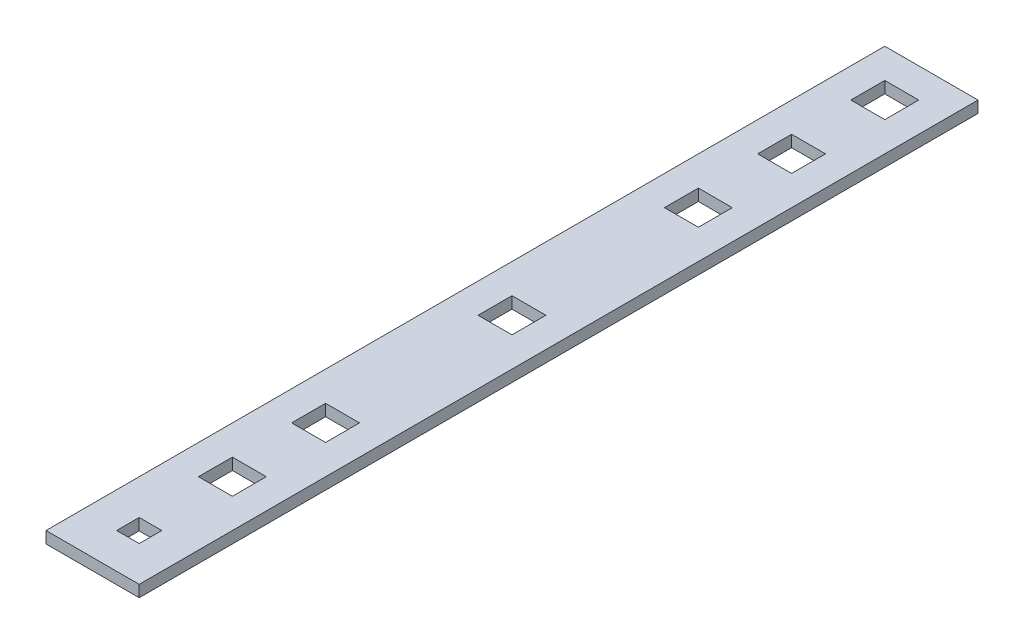
ISO-10303-21;
HEADER;
FILE_DESCRIPTION(('STEP AP214'),'2;1');
FILE_NAME('part.step','',(''),(''),'','','');
FILE_SCHEMA(('AUTOMOTIVE_DESIGN { 1 0 10303 214 1 1 1 1 }'));
ENDSEC;
DATA;
#1=APPLICATION_CONTEXT('core data for automotive mechanical design processes');
#2=APPLICATION_PROTOCOL_DEFINITION('international standard','automotive_design',2000,#1);
#3=PRODUCT_CONTEXT('',#1,'mechanical');
#4=PRODUCT('Part','Part','',(#3));
#5=PRODUCT_RELATED_PRODUCT_CATEGORY('part','',(#4));
#6=PRODUCT_DEFINITION_FORMATION('','',#4);
#7=PRODUCT_DEFINITION_CONTEXT('part definition',#1,'design');
#8=PRODUCT_DEFINITION('design','',#6,#7);
#9=PRODUCT_DEFINITION_SHAPE('','',#8);
#10=(LENGTH_UNIT() NAMED_UNIT(*) SI_UNIT(.MILLI.,.METRE.));
#11=(NAMED_UNIT(*) PLANE_ANGLE_UNIT() SI_UNIT($,.RADIAN.));
#12=(NAMED_UNIT(*) SI_UNIT($,.STERADIAN.) SOLID_ANGLE_UNIT());
#13=UNCERTAINTY_MEASURE_WITH_UNIT(LENGTH_MEASURE(1.E-05),#10,'distance_accuracy_value','');
#14=(GEOMETRIC_REPRESENTATION_CONTEXT(3) GLOBAL_UNCERTAINTY_ASSIGNED_CONTEXT((#13)) GLOBAL_UNIT_ASSIGNED_CONTEXT((#10,
#11,#12)) REPRESENTATION_CONTEXT('',''));
#15=CARTESIAN_POINT('',(0.,0.,0.));
#16=DIRECTION('',(0.,0.,1.));
#17=DIRECTION('',(1.,0.,0.));
#18=AXIS2_PLACEMENT_3D('',#15,#16,#17);
#19=CARTESIAN_POINT('',(0.,1.5875,0.));
#20=DIRECTION('',(0.,1.,0.));
#21=DIRECTION('',(0.,0.,1.));
#22=AXIS2_PLACEMENT_3D('',#19,#20,#21);
#23=PLANE('',#22);
#24=DIRECTION('',(0.,0.,1.));
#25=VECTOR('',#24,1.);
#26=CARTESIAN_POINT('',(0.,1.5875,-101.537542425712));
#27=LINE('',#26,#25);
#28=CARTESIAN_POINT('',(0.,1.5875,-101.537542425712));
#29=VERTEX_POINT('',#28);
#30=CARTESIAN_POINT('',(0.,1.5875,12.7624575742885));
#31=VERTEX_POINT('',#30);
#32=EDGE_CURVE('E464',#29,#31,#27,.T.);
#33=ORIENTED_EDGE('',*,*,#32,.T.);
#34=DIRECTION('',(1.,0.,0.));
#35=VECTOR('',#34,1.);
#36=CARTESIAN_POINT('',(0.,1.5875,12.7624575742885));
#37=LINE('',#36,#35);
#38=CARTESIAN_POINT('',(12.7,1.5875,12.7624575742885));
#39=VERTEX_POINT('',#38);
#40=EDGE_CURVE('E467',#31,#39,#37,.T.);
#41=ORIENTED_EDGE('',*,*,#40,.T.);
#42=DIRECTION('',(0.,0.,-1.));
#43=VECTOR('',#42,1.);
#44=CARTESIAN_POINT('',(12.7,1.5875,-101.537542425712));
#45=LINE('',#44,#43);
#46=CARTESIAN_POINT('',(12.7,1.5875,-101.537542425712));
#47=VERTEX_POINT('',#46);
#48=EDGE_CURVE('E470',#39,#47,#45,.T.);
#49=ORIENTED_EDGE('',*,*,#48,.T.);
#50=DIRECTION('',(-1.,0.,0.));
#51=VECTOR('',#50,1.);
#52=CARTESIAN_POINT('',(0.,1.5875,-101.537542425712));
#53=LINE('',#52,#51);
#54=EDGE_CURVE('E472',#47,#29,#53,.T.);
#55=ORIENTED_EDGE('',*,*,#54,.T.);
#56=EDGE_LOOP('',(#33,#41,#49,#55));
#57=FACE_BOUND('',#56,.T.);
#58=DIRECTION('',(1.,0.,0.));
#59=VECTOR('',#58,1.);
#60=CARTESIAN_POINT('',(4.0372,1.5875,-92.8747424257115));
#61=LINE('',#60,#59);
#62=CARTESIAN_POINT('',(4.0372,1.5875,-92.8747424257115));
#63=VERTEX_POINT('',#62);
#64=CARTESIAN_POINT('',(8.66,1.5875,-92.8747424257115));
#65=VERTEX_POINT('',#64);
#66=EDGE_CURVE('E435',#63,#65,#61,.T.);
#67=ORIENTED_EDGE('',*,*,#66,.F.);
#68=DIRECTION('',(0.,0.,1.));
#69=VECTOR('',#68,1.);
#70=CARTESIAN_POINT('',(4.0372,1.5875,-97.4975424257115));
#71=LINE('',#70,#69);
#72=CARTESIAN_POINT('',(4.0372,1.5875,-97.4975424257115));
#73=VERTEX_POINT('',#72);
#74=EDGE_CURVE('E433',#73,#63,#71,.T.);
#75=ORIENTED_EDGE('',*,*,#74,.F.);
#76=DIRECTION('',(-1.,0.,0.));
#77=VECTOR('',#76,1.);
#78=CARTESIAN_POINT('',(4.0372,1.5875,-97.4975424257115));
#79=LINE('',#78,#77);
#80=CARTESIAN_POINT('',(8.66,1.5875,-97.4975424257115));
#81=VERTEX_POINT('',#80);
#82=EDGE_CURVE('E441',#81,#73,#79,.T.);
#83=ORIENTED_EDGE('',*,*,#82,.F.);
#84=DIRECTION('',(0.,0.,-1.));
#85=VECTOR('',#84,1.);
#86=CARTESIAN_POINT('',(8.66,1.5875,-97.4975424257115));
#87=LINE('',#86,#85);
#88=EDGE_CURVE('E438',#65,#81,#87,.T.);
#89=ORIENTED_EDGE('',*,*,#88,.F.);
#90=EDGE_LOOP('',(#67,#75,#83,#89));
#91=FACE_BOUND('',#90,.T.);
#92=DIRECTION('',(0.,0.,1.));
#93=VECTOR('',#92,1.);
#94=CARTESIAN_POINT('',(4.03720000000013,1.5875,-84.7975424257115));
#95=LINE('',#94,#93);
#96=CARTESIAN_POINT('',(4.03720000000013,1.5875,-84.7975424257115));
#97=VERTEX_POINT('',#96);
#98=CARTESIAN_POINT('',(4.03720000000013,1.5875,-80.1747424257115));
#99=VERTEX_POINT('',#98);
#100=EDGE_CURVE('E404',#97,#99,#95,.T.);
#101=ORIENTED_EDGE('',*,*,#100,.F.);
#102=DIRECTION('',(-1.,0.,0.));
#103=VECTOR('',#102,1.);
#104=CARTESIAN_POINT('',(4.03720000000013,1.5875,-84.7975424257115));
#105=LINE('',#104,#103);
#106=CARTESIAN_POINT('',(8.66000000000013,1.5875,-84.7975424257115));
#107=VERTEX_POINT('',#106);
#108=EDGE_CURVE('E402',#107,#97,#105,.T.);
#109=ORIENTED_EDGE('',*,*,#108,.F.);
#110=DIRECTION('',(0.,0.,-1.));
#111=VECTOR('',#110,1.);
#112=CARTESIAN_POINT('',(8.66000000000013,1.5875,-84.7975424257115));
#113=LINE('',#112,#111);
#114=CARTESIAN_POINT('',(8.66000000000013,1.5875,-80.1747424257115));
#115=VERTEX_POINT('',#114);
#116=EDGE_CURVE('E410',#115,#107,#113,.T.);
#117=ORIENTED_EDGE('',*,*,#116,.F.);
#118=DIRECTION('',(1.,0.,0.));
#119=VECTOR('',#118,1.);
#120=CARTESIAN_POINT('',(4.03720000000013,1.5875,-80.1747424257115));
#121=LINE('',#120,#119);
#122=EDGE_CURVE('E407',#99,#115,#121,.T.);
#123=ORIENTED_EDGE('',*,*,#122,.F.);
#124=EDGE_LOOP('',(#101,#109,#117,#123));
#125=FACE_BOUND('',#124,.T.);
#126=DIRECTION('',(1.,0.,0.));
#127=VECTOR('',#126,1.);
#128=CARTESIAN_POINT('',(4.81000000000001,1.5875,7.95245757428848));
#129=LINE('',#128,#127);
#130=CARTESIAN_POINT('',(4.81000000000001,1.5875,7.95245757428848));
#131=VERTEX_POINT('',#130);
#132=CARTESIAN_POINT('',(7.89000000000001,1.5875,7.95245757428848));
#133=VERTEX_POINT('',#132);
#134=EDGE_CURVE('E373',#131,#133,#129,.T.);
#135=ORIENTED_EDGE('',*,*,#134,.F.);
#136=DIRECTION('',(0.,0.,1.));
#137=VECTOR('',#136,1.);
#138=CARTESIAN_POINT('',(4.81000000000001,1.5875,4.87245757428848));
#139=LINE('',#138,#137);
#140=CARTESIAN_POINT('',(4.81000000000001,1.5875,4.87245757428848));
#141=VERTEX_POINT('',#140);
#142=EDGE_CURVE('E371',#141,#131,#139,.T.);
#143=ORIENTED_EDGE('',*,*,#142,.F.);
#144=DIRECTION('',(-1.,0.,0.));
#145=VECTOR('',#144,1.);
#146=CARTESIAN_POINT('',(4.81000000000001,1.5875,4.87245757428848));
#147=LINE('',#146,#145);
#148=CARTESIAN_POINT('',(7.89000000000001,1.5875,4.87245757428848));
#149=VERTEX_POINT('',#148);
#150=EDGE_CURVE('E379',#149,#141,#147,.T.);
#151=ORIENTED_EDGE('',*,*,#150,.F.);
#152=DIRECTION('',(0.,0.,-1.));
#153=VECTOR('',#152,1.);
#154=CARTESIAN_POINT('',(7.89000000000001,1.5875,4.87245757428848));
#155=LINE('',#154,#153);
#156=EDGE_CURVE('E376',#133,#149,#155,.T.);
#157=ORIENTED_EDGE('',*,*,#156,.F.);
#158=EDGE_LOOP('',(#135,#143,#151,#157));
#159=FACE_BOUND('',#158,.T.);
#160=DIRECTION('',(0.,0.,1.));
#161=VECTOR('',#160,1.);
#162=CARTESIAN_POINT('',(4.03720000000027,1.5875,-72.0975424257115));
#163=LINE('',#162,#161);
#164=CARTESIAN_POINT('',(4.03720000000027,1.5875,-72.0975424257115));
#165=VERTEX_POINT('',#164);
#166=CARTESIAN_POINT('',(4.03720000000027,1.5875,-67.4747424257115));
#167=VERTEX_POINT('',#166);
#168=EDGE_CURVE('E342',#165,#167,#163,.T.);
#169=ORIENTED_EDGE('',*,*,#168,.F.);
#170=DIRECTION('',(-1.,0.,0.));
#171=VECTOR('',#170,1.);
#172=CARTESIAN_POINT('',(4.03720000000027,1.5875,-72.0975424257115));
#173=LINE('',#172,#171);
#174=CARTESIAN_POINT('',(8.66000000000026,1.5875,-72.0975424257115));
#175=VERTEX_POINT('',#174);
#176=EDGE_CURVE('E340',#175,#165,#173,.T.);
#177=ORIENTED_EDGE('',*,*,#176,.F.);
#178=DIRECTION('',(0.,0.,-1.));
#179=VECTOR('',#178,1.);
#180=CARTESIAN_POINT('',(8.66000000000026,1.5875,-72.0975424257115));
#181=LINE('',#180,#179);
#182=CARTESIAN_POINT('',(8.66000000000026,1.5875,-67.4747424257115));
#183=VERTEX_POINT('',#182);
#184=EDGE_CURVE('E348',#183,#175,#181,.T.);
#185=ORIENTED_EDGE('',*,*,#184,.F.);
#186=DIRECTION('',(1.,0.,0.));
#187=VECTOR('',#186,1.);
#188=CARTESIAN_POINT('',(4.03720000000027,1.5875,-67.4747424257115));
#189=LINE('',#188,#187);
#190=EDGE_CURVE('E345',#167,#183,#189,.T.);
#191=ORIENTED_EDGE('',*,*,#190,.F.);
#192=EDGE_LOOP('',(#169,#177,#185,#191));
#193=FACE_BOUND('',#192,.T.);
#194=DIRECTION('',(0.,0.,1.));
#195=VECTOR('',#194,1.);
#196=CARTESIAN_POINT('',(4.03720000000053,1.5875,-46.6975424257115));
#197=LINE('',#196,#195);
#198=CARTESIAN_POINT('',(4.03720000000053,1.5875,-46.6975424257115));
#199=VERTEX_POINT('',#198);
#200=CARTESIAN_POINT('',(4.03720000000053,1.5875,-42.0747424257115));
#201=VERTEX_POINT('',#200);
#202=EDGE_CURVE('E311',#199,#201,#197,.T.);
#203=ORIENTED_EDGE('',*,*,#202,.F.);
#204=DIRECTION('',(-1.,0.,0.));
#205=VECTOR('',#204,1.);
#206=CARTESIAN_POINT('',(4.03720000000053,1.5875,-46.6975424257115));
#207=LINE('',#206,#205);
#208=CARTESIAN_POINT('',(8.66000000000053,1.5875,-46.6975424257115));
#209=VERTEX_POINT('',#208);
#210=EDGE_CURVE('E309',#209,#199,#207,.T.);
#211=ORIENTED_EDGE('',*,*,#210,.F.);
#212=DIRECTION('',(0.,0.,-1.));
#213=VECTOR('',#212,1.);
#214=CARTESIAN_POINT('',(8.66000000000053,1.5875,-46.6975424257115));
#215=LINE('',#214,#213);
#216=CARTESIAN_POINT('',(8.66000000000053,1.5875,-42.0747424257115));
#217=VERTEX_POINT('',#216);
#218=EDGE_CURVE('E317',#217,#209,#215,.T.);
#219=ORIENTED_EDGE('',*,*,#218,.F.);
#220=DIRECTION('',(1.,0.,0.));
#221=VECTOR('',#220,1.);
#222=CARTESIAN_POINT('',(4.03720000000053,1.5875,-42.0747424257115));
#223=LINE('',#222,#221);
#224=EDGE_CURVE('E314',#201,#217,#223,.T.);
#225=ORIENTED_EDGE('',*,*,#224,.F.);
#226=EDGE_LOOP('',(#203,#211,#219,#225));
#227=FACE_BOUND('',#226,.T.);
#228=DIRECTION('',(0.,0.,1.));
#229=VECTOR('',#228,1.);
#230=CARTESIAN_POINT('',(4.0372000000008,1.5875,-21.2975424257115));
#231=LINE('',#230,#229);
#232=CARTESIAN_POINT('',(4.0372000000008,1.5875,-21.2975424257115));
#233=VERTEX_POINT('',#232);
#234=CARTESIAN_POINT('',(4.0372000000008,1.5875,-16.6747424257115));
#235=VERTEX_POINT('',#234);
#236=EDGE_CURVE('E280',#233,#235,#231,.T.);
#237=ORIENTED_EDGE('',*,*,#236,.F.);
#238=DIRECTION('',(-1.,0.,0.));
#239=VECTOR('',#238,1.);
#240=CARTESIAN_POINT('',(4.0372000000008,1.5875,-21.2975424257115));
#241=LINE('',#240,#239);
#242=CARTESIAN_POINT('',(8.6600000000008,1.5875,-21.2975424257115));
#243=VERTEX_POINT('',#242);
#244=EDGE_CURVE('E278',#243,#233,#241,.T.);
#245=ORIENTED_EDGE('',*,*,#244,.F.);
#246=DIRECTION('',(0.,0.,-1.));
#247=VECTOR('',#246,1.);
#248=CARTESIAN_POINT('',(8.6600000000008,1.5875,-21.2975424257115));
#249=LINE('',#248,#247);
#250=CARTESIAN_POINT('',(8.6600000000008,1.5875,-16.6747424257115));
#251=VERTEX_POINT('',#250);
#252=EDGE_CURVE('E286',#251,#243,#249,.T.);
#253=ORIENTED_EDGE('',*,*,#252,.F.);
#254=DIRECTION('',(1.,0.,0.));
#255=VECTOR('',#254,1.);
#256=CARTESIAN_POINT('',(4.0372000000008,1.5875,-16.6747424257115));
#257=LINE('',#256,#255);
#258=EDGE_CURVE('E283',#235,#251,#257,.T.);
#259=ORIENTED_EDGE('',*,*,#258,.F.);
#260=EDGE_LOOP('',(#237,#245,#253,#259));
#261=FACE_BOUND('',#260,.T.);
#262=DIRECTION('',(0.,0.,1.));
#263=VECTOR('',#262,1.);
#264=CARTESIAN_POINT('',(4.03720000000093,1.5875,-8.59754242571152));
#265=LINE('',#264,#263);
#266=CARTESIAN_POINT('',(4.03720000000093,1.5875,-8.59754242571152));
#267=VERTEX_POINT('',#266);
#268=CARTESIAN_POINT('',(4.03720000000093,1.5875,-3.97474242571152));
#269=VERTEX_POINT('',#268);
#270=EDGE_CURVE('E250',#267,#269,#265,.T.);
#271=ORIENTED_EDGE('',*,*,#270,.F.);
#272=DIRECTION('',(-1.,0.,0.));
#273=VECTOR('',#272,1.);
#274=CARTESIAN_POINT('',(4.03720000000093,1.5875,-8.59754242571152));
#275=LINE('',#274,#273);
#276=CARTESIAN_POINT('',(8.66000000000093,1.5875,-8.59754242571152));
#277=VERTEX_POINT('',#276);
#278=EDGE_CURVE('E242',#277,#267,#275,.T.);
#279=ORIENTED_EDGE('',*,*,#278,.F.);
#280=DIRECTION('',(0.,0.,-1.));
#281=VECTOR('',#280,1.);
#282=CARTESIAN_POINT('',(8.66000000000093,1.5875,-8.59754242571152));
#283=LINE('',#282,#281);
#284=CARTESIAN_POINT('',(8.66000000000093,1.5875,-3.97474242571152));
#285=VERTEX_POINT('',#284);
#286=EDGE_CURVE('E264',#285,#277,#283,.T.);
#287=ORIENTED_EDGE('',*,*,#286,.F.);
#288=DIRECTION('',(1.,0.,0.));
#289=VECTOR('',#288,1.);
#290=CARTESIAN_POINT('',(4.03720000000093,1.5875,-3.97474242571152));
#291=LINE('',#290,#289);
#292=EDGE_CURVE('E262',#269,#285,#291,.T.);
#293=ORIENTED_EDGE('',*,*,#292,.F.);
#294=EDGE_LOOP('',(#271,#279,#287,#293));
#295=FACE_BOUND('',#294,.T.);
#296=ADVANCED_FACE('F33',(#57,#91,#125,#159,#193,#227,#261,#295),#23,.T.);
#297=CARTESIAN_POINT('',(0.,0.,0.));
#298=DIRECTION('',(0.,1.,0.));
#299=DIRECTION('',(0.,0.,1.));
#300=AXIS2_PLACEMENT_3D('',#297,#298,#299);
#301=PLANE('',#300);
#302=DIRECTION('',(-1.,0.,0.));
#303=VECTOR('',#302,1.);
#304=CARTESIAN_POINT('',(4.0372000000008,0.,-21.2975424257115));
#305=LINE('',#304,#303);
#306=CARTESIAN_POINT('',(8.6600000000008,0.,-21.2975424257115));
#307=VERTEX_POINT('',#306);
#308=CARTESIAN_POINT('',(4.0372000000008,0.,-21.2975424257115));
#309=VERTEX_POINT('',#308);
#310=EDGE_CURVE('E258',#307,#309,#305,.T.);
#311=ORIENTED_EDGE('',*,*,#310,.T.);
#312=DIRECTION('',(0.,0.,1.));
#313=VECTOR('',#312,1.);
#314=CARTESIAN_POINT('',(4.0372000000008,0.,-21.2975424257115));
#315=LINE('',#314,#313);
#316=CARTESIAN_POINT('',(4.0372000000008,0.,-16.6747424257115));
#317=VERTEX_POINT('',#316);
#318=EDGE_CURVE('E291',#309,#317,#315,.T.);
#319=ORIENTED_EDGE('',*,*,#318,.T.);
#320=DIRECTION('',(1.,0.,0.));
#321=VECTOR('',#320,1.);
#322=CARTESIAN_POINT('',(4.0372000000008,0.,-16.6747424257115));
#323=LINE('',#322,#321);
#324=CARTESIAN_POINT('',(8.6600000000008,0.,-16.6747424257115));
#325=VERTEX_POINT('',#324);
#326=EDGE_CURVE('E294',#317,#325,#323,.T.);
#327=ORIENTED_EDGE('',*,*,#326,.T.);
#328=DIRECTION('',(0.,0.,-1.));
#329=VECTOR('',#328,1.);
#330=CARTESIAN_POINT('',(8.6600000000008,0.,-21.2975424257115));
#331=LINE('',#330,#329);
#332=EDGE_CURVE('E281',#325,#307,#331,.T.);
#333=ORIENTED_EDGE('',*,*,#332,.T.);
#334=EDGE_LOOP('',(#311,#319,#327,#333));
#335=FACE_BOUND('',#334,.T.);
#336=DIRECTION('',(-1.,0.,0.));
#337=VECTOR('',#336,1.);
#338=CARTESIAN_POINT('',(4.03720000000027,0.,-72.0975424257115));
#339=LINE('',#338,#337);
#340=CARTESIAN_POINT('',(8.66000000000026,0.,-72.0975424257115));
#341=VERTEX_POINT('',#340);
#342=CARTESIAN_POINT('',(4.03720000000027,0.,-72.0975424257115));
#343=VERTEX_POINT('',#342);
#344=EDGE_CURVE('E339',#341,#343,#339,.T.);
#345=ORIENTED_EDGE('',*,*,#344,.T.);
#346=DIRECTION('',(0.,0.,1.));
#347=VECTOR('',#346,1.);
#348=CARTESIAN_POINT('',(4.03720000000027,0.,-72.0975424257115));
#349=LINE('',#348,#347);
#350=CARTESIAN_POINT('',(4.03720000000027,0.,-67.4747424257115));
#351=VERTEX_POINT('',#350);
#352=EDGE_CURVE('E353',#343,#351,#349,.T.);
#353=ORIENTED_EDGE('',*,*,#352,.T.);
#354=DIRECTION('',(1.,0.,0.));
#355=VECTOR('',#354,1.);
#356=CARTESIAN_POINT('',(4.03720000000027,0.,-67.4747424257115));
#357=LINE('',#356,#355);
#358=CARTESIAN_POINT('',(8.66000000000026,0.,-67.4747424257115));
#359=VERTEX_POINT('',#358);
#360=EDGE_CURVE('E356',#351,#359,#357,.T.);
#361=ORIENTED_EDGE('',*,*,#360,.T.);
#362=DIRECTION('',(0.,0.,-1.));
#363=VECTOR('',#362,1.);
#364=CARTESIAN_POINT('',(8.66000000000026,0.,-72.0975424257115));
#365=LINE('',#364,#363);
#366=EDGE_CURVE('E343',#359,#341,#365,.T.);
#367=ORIENTED_EDGE('',*,*,#366,.T.);
#368=EDGE_LOOP('',(#345,#353,#361,#367));
#369=FACE_BOUND('',#368,.T.);
#370=DIRECTION('',(-1.,0.,0.));
#371=VECTOR('',#370,1.);
#372=CARTESIAN_POINT('',(4.03720000000013,0.,-84.7975424257115));
#373=LINE('',#372,#371);
#374=CARTESIAN_POINT('',(8.66000000000013,0.,-84.7975424257115));
#375=VERTEX_POINT('',#374);
#376=CARTESIAN_POINT('',(4.03720000000013,0.,-84.7975424257115));
#377=VERTEX_POINT('',#376);
#378=EDGE_CURVE('E401',#375,#377,#373,.T.);
#379=ORIENTED_EDGE('',*,*,#378,.T.);
#380=DIRECTION('',(0.,0.,1.));
#381=VECTOR('',#380,1.);
#382=CARTESIAN_POINT('',(4.03720000000013,0.,-84.7975424257115));
#383=LINE('',#382,#381);
#384=CARTESIAN_POINT('',(4.03720000000013,0.,-80.1747424257115));
#385=VERTEX_POINT('',#384);
#386=EDGE_CURVE('E415',#377,#385,#383,.T.);
#387=ORIENTED_EDGE('',*,*,#386,.T.);
#388=DIRECTION('',(1.,0.,0.));
#389=VECTOR('',#388,1.);
#390=CARTESIAN_POINT('',(4.03720000000013,0.,-80.1747424257115));
#391=LINE('',#390,#389);
#392=CARTESIAN_POINT('',(8.66000000000013,0.,-80.1747424257115));
#393=VERTEX_POINT('',#392);
#394=EDGE_CURVE('E418',#385,#393,#391,.T.);
#395=ORIENTED_EDGE('',*,*,#394,.T.);
#396=DIRECTION('',(0.,0.,-1.));
#397=VECTOR('',#396,1.);
#398=CARTESIAN_POINT('',(8.66000000000013,0.,-84.7975424257115));
#399=LINE('',#398,#397);
#400=EDGE_CURVE('E405',#393,#375,#399,.T.);
#401=ORIENTED_EDGE('',*,*,#400,.T.);
#402=EDGE_LOOP('',(#379,#387,#395,#401));
#403=FACE_BOUND('',#402,.T.);
#404=DIRECTION('',(0.,0.,1.));
#405=VECTOR('',#404,1.);
#406=CARTESIAN_POINT('',(0.,0.,-101.537542425712));
#407=LINE('',#406,#405);
#408=CARTESIAN_POINT('',(0.,0.,-101.537542425712));
#409=VERTEX_POINT('',#408);
#410=CARTESIAN_POINT('',(0.,0.,12.7624575742885));
#411=VERTEX_POINT('',#410);
#412=EDGE_CURVE('E463',#409,#411,#407,.T.);
#413=ORIENTED_EDGE('',*,*,#412,.F.);
#414=DIRECTION('',(-1.,0.,0.));
#415=VECTOR('',#414,1.);
#416=CARTESIAN_POINT('',(0.,0.,-101.537542425712));
#417=LINE('',#416,#415);
#418=CARTESIAN_POINT('',(12.7,0.,-101.537542425712));
#419=VERTEX_POINT('',#418);
#420=EDGE_CURVE('E468',#419,#409,#417,.T.);
#421=ORIENTED_EDGE('',*,*,#420,.F.);
#422=DIRECTION('',(0.,0.,-1.));
#423=VECTOR('',#422,1.);
#424=CARTESIAN_POINT('',(12.7,0.,-101.537542425712));
#425=LINE('',#424,#423);
#426=CARTESIAN_POINT('',(12.7,0.,12.7624575742885));
#427=VERTEX_POINT('',#426);
#428=EDGE_CURVE('E479',#427,#419,#425,.T.);
#429=ORIENTED_EDGE('',*,*,#428,.F.);
#430=DIRECTION('',(1.,0.,0.));
#431=VECTOR('',#430,1.);
#432=CARTESIAN_POINT('',(0.,0.,12.7624575742885));
#433=LINE('',#432,#431);
#434=EDGE_CURVE('E477',#411,#427,#433,.T.);
#435=ORIENTED_EDGE('',*,*,#434,.F.);
#436=EDGE_LOOP('',(#413,#421,#429,#435));
#437=FACE_BOUND('',#436,.T.);
#438=DIRECTION('',(0.,0.,1.));
#439=VECTOR('',#438,1.);
#440=CARTESIAN_POINT('',(4.0372,0.,-97.4975424257115));
#441=LINE('',#440,#439);
#442=CARTESIAN_POINT('',(4.0372,0.,-97.4975424257115));
#443=VERTEX_POINT('',#442);
#444=CARTESIAN_POINT('',(4.0372,0.,-92.8747424257115));
#445=VERTEX_POINT('',#444);
#446=EDGE_CURVE('E432',#443,#445,#441,.T.);
#447=ORIENTED_EDGE('',*,*,#446,.T.);
#448=DIRECTION('',(1.,0.,0.));
#449=VECTOR('',#448,1.);
#450=CARTESIAN_POINT('',(4.0372,0.,-92.8747424257115));
#451=LINE('',#450,#449);
#452=CARTESIAN_POINT('',(8.66,0.,-92.8747424257115));
#453=VERTEX_POINT('',#452);
#454=EDGE_CURVE('E446',#445,#453,#451,.T.);
#455=ORIENTED_EDGE('',*,*,#454,.T.);
#456=DIRECTION('',(0.,0.,-1.));
#457=VECTOR('',#456,1.);
#458=CARTESIAN_POINT('',(8.66,0.,-97.4975424257115));
#459=LINE('',#458,#457);
#460=CARTESIAN_POINT('',(8.66,0.,-97.4975424257115));
#461=VERTEX_POINT('',#460);
#462=EDGE_CURVE('E449',#453,#461,#459,.T.);
#463=ORIENTED_EDGE('',*,*,#462,.T.);
#464=DIRECTION('',(-1.,0.,0.));
#465=VECTOR('',#464,1.);
#466=CARTESIAN_POINT('',(4.0372,0.,-97.4975424257115));
#467=LINE('',#466,#465);
#468=EDGE_CURVE('E436',#461,#443,#467,.T.);
#469=ORIENTED_EDGE('',*,*,#468,.T.);
#470=EDGE_LOOP('',(#447,#455,#463,#469));
#471=FACE_BOUND('',#470,.T.);
#472=DIRECTION('',(0.,0.,1.));
#473=VECTOR('',#472,1.);
#474=CARTESIAN_POINT('',(4.81000000000001,0.,4.87245757428848));
#475=LINE('',#474,#473);
#476=CARTESIAN_POINT('',(4.81000000000001,0.,4.87245757428848));
#477=VERTEX_POINT('',#476);
#478=CARTESIAN_POINT('',(4.81000000000001,0.,7.95245757428848));
#479=VERTEX_POINT('',#478);
#480=EDGE_CURVE('E370',#477,#479,#475,.T.);
#481=ORIENTED_EDGE('',*,*,#480,.T.);
#482=DIRECTION('',(1.,0.,0.));
#483=VECTOR('',#482,1.);
#484=CARTESIAN_POINT('',(4.81000000000001,0.,7.95245757428848));
#485=LINE('',#484,#483);
#486=CARTESIAN_POINT('',(7.89000000000001,0.,7.95245757428848));
#487=VERTEX_POINT('',#486);
#488=EDGE_CURVE('E384',#479,#487,#485,.T.);
#489=ORIENTED_EDGE('',*,*,#488,.T.);
#490=DIRECTION('',(0.,0.,-1.));
#491=VECTOR('',#490,1.);
#492=CARTESIAN_POINT('',(7.89000000000001,0.,4.87245757428848));
#493=LINE('',#492,#491);
#494=CARTESIAN_POINT('',(7.89000000000001,0.,4.87245757428848));
#495=VERTEX_POINT('',#494);
#496=EDGE_CURVE('E387',#487,#495,#493,.T.);
#497=ORIENTED_EDGE('',*,*,#496,.T.);
#498=DIRECTION('',(-1.,0.,0.));
#499=VECTOR('',#498,1.);
#500=CARTESIAN_POINT('',(4.81000000000001,0.,4.87245757428848));
#501=LINE('',#500,#499);
#502=EDGE_CURVE('E374',#495,#477,#501,.T.);
#503=ORIENTED_EDGE('',*,*,#502,.T.);
#504=EDGE_LOOP('',(#481,#489,#497,#503));
#505=FACE_BOUND('',#504,.T.);
#506=DIRECTION('',(-1.,0.,0.));
#507=VECTOR('',#506,1.);
#508=CARTESIAN_POINT('',(4.03720000000053,0.,-46.6975424257115));
#509=LINE('',#508,#507);
#510=CARTESIAN_POINT('',(8.66000000000053,0.,-46.6975424257115));
#511=VERTEX_POINT('',#510);
#512=CARTESIAN_POINT('',(4.03720000000053,0.,-46.6975424257115));
#513=VERTEX_POINT('',#512);
#514=EDGE_CURVE('E308',#511,#513,#509,.T.);
#515=ORIENTED_EDGE('',*,*,#514,.T.);
#516=DIRECTION('',(0.,0.,1.));
#517=VECTOR('',#516,1.);
#518=CARTESIAN_POINT('',(4.03720000000053,0.,-46.6975424257115));
#519=LINE('',#518,#517);
#520=CARTESIAN_POINT('',(4.03720000000053,0.,-42.0747424257115));
#521=VERTEX_POINT('',#520);
#522=EDGE_CURVE('E322',#513,#521,#519,.T.);
#523=ORIENTED_EDGE('',*,*,#522,.T.);
#524=DIRECTION('',(1.,0.,0.));
#525=VECTOR('',#524,1.);
#526=CARTESIAN_POINT('',(4.03720000000053,0.,-42.0747424257115));
#527=LINE('',#526,#525);
#528=CARTESIAN_POINT('',(8.66000000000053,0.,-42.0747424257115));
#529=VERTEX_POINT('',#528);
#530=EDGE_CURVE('E325',#521,#529,#527,.T.);
#531=ORIENTED_EDGE('',*,*,#530,.T.);
#532=DIRECTION('',(0.,0.,-1.));
#533=VECTOR('',#532,1.);
#534=CARTESIAN_POINT('',(8.66000000000053,0.,-46.6975424257115));
#535=LINE('',#534,#533);
#536=EDGE_CURVE('E312',#529,#511,#535,.T.);
#537=ORIENTED_EDGE('',*,*,#536,.T.);
#538=EDGE_LOOP('',(#515,#523,#531,#537));
#539=FACE_BOUND('',#538,.T.);
#540=DIRECTION('',(-1.,0.,0.));
#541=VECTOR('',#540,1.);
#542=CARTESIAN_POINT('',(4.03720000000093,0.,-8.59754242571152));
#543=LINE('',#542,#541);
#544=CARTESIAN_POINT('',(8.66000000000093,0.,-8.59754242571152));
#545=VERTEX_POINT('',#544);
#546=CARTESIAN_POINT('',(4.03720000000093,0.,-8.59754242571152));
#547=VERTEX_POINT('',#546);
#548=EDGE_CURVE('E56',#545,#547,#543,.T.);
#549=ORIENTED_EDGE('',*,*,#548,.T.);
#550=DIRECTION('',(0.,0.,1.));
#551=VECTOR('',#550,1.);
#552=CARTESIAN_POINT('',(4.03720000000093,0.,-8.59754242571152));
#553=LINE('',#552,#551);
#554=CARTESIAN_POINT('',(4.03720000000093,0.,-3.97474242571152));
#555=VERTEX_POINT('',#554);
#556=EDGE_CURVE('E257',#547,#555,#553,.T.);
#557=ORIENTED_EDGE('',*,*,#556,.T.);
#558=DIRECTION('',(1.,0.,0.));
#559=VECTOR('',#558,1.);
#560=CARTESIAN_POINT('',(4.03720000000093,0.,-3.97474242571152));
#561=LINE('',#560,#559);
#562=CARTESIAN_POINT('',(8.66000000000093,0.,-3.97474242571152));
#563=VERTEX_POINT('',#562);
#564=EDGE_CURVE('E270',#555,#563,#561,.T.);
#565=ORIENTED_EDGE('',*,*,#564,.T.);
#566=DIRECTION('',(0.,0.,-1.));
#567=VECTOR('',#566,1.);
#568=CARTESIAN_POINT('',(8.66000000000093,0.,-8.59754242571152));
#569=LINE('',#568,#567);
#570=EDGE_CURVE('E251',#563,#545,#569,.T.);
#571=ORIENTED_EDGE('',*,*,#570,.T.);
#572=EDGE_LOOP('',(#549,#557,#565,#571));
#573=FACE_BOUND('',#572,.T.);
#574=ADVANCED_FACE('F497',(#335,#369,#403,#437,#471,#505,#539,#573),#301,.F.);
#575=CARTESIAN_POINT('',(0.,1.5875,-101.537542425712));
#576=DIRECTION('',(1.,0.,0.));
#577=DIRECTION('',(0.,0.,-1.));
#578=AXIS2_PLACEMENT_3D('',#575,#576,#577);
#579=PLANE('',#578);
#580=ORIENTED_EDGE('',*,*,#412,.T.);
#581=DIRECTION('',(0.,-1.,0.));
#582=VECTOR('',#581,1.);
#583=CARTESIAN_POINT('',(0.,1.5875,12.7624575742885));
#584=LINE('',#583,#582);
#585=EDGE_CURVE('E11',#31,#411,#584,.T.);
#586=ORIENTED_EDGE('',*,*,#585,.F.);
#587=ORIENTED_EDGE('',*,*,#32,.F.);
#588=DIRECTION('',(0.,-1.,0.));
#589=VECTOR('',#588,1.);
#590=CARTESIAN_POINT('',(0.,1.5875,-101.537542425712));
#591=LINE('',#590,#589);
#592=EDGE_CURVE('E474',#29,#409,#591,.T.);
#593=ORIENTED_EDGE('',*,*,#592,.T.);
#594=EDGE_LOOP('',(#580,#586,#587,#593));
#595=FACE_BOUND('',#594,.T.);
#596=ADVANCED_FACE('F35',(#595),#579,.F.);
#597=CARTESIAN_POINT('',(0.,1.5875,12.7624575742885));
#598=DIRECTION('',(0.,0.,-1.));
#599=DIRECTION('',(-1.,0.,0.));
#600=AXIS2_PLACEMENT_3D('',#597,#598,#599);
#601=PLANE('',#600);
#602=ORIENTED_EDGE('',*,*,#434,.T.);
#603=DIRECTION('',(0.,-1.,0.));
#604=VECTOR('',#603,1.);
#605=CARTESIAN_POINT('',(12.7,1.5875,12.7624575742885));
#606=LINE('',#605,#604);
#607=EDGE_CURVE('E41',#39,#427,#606,.T.);
#608=ORIENTED_EDGE('',*,*,#607,.F.);
#609=ORIENTED_EDGE('',*,*,#40,.F.);
#610=ORIENTED_EDGE('',*,*,#585,.T.);
#611=EDGE_LOOP('',(#602,#608,#609,#610));
#612=FACE_BOUND('',#611,.T.);
#613=ADVANCED_FACE('F508',(#612),#601,.F.);
#614=CARTESIAN_POINT('',(12.7,1.5875,-101.537542425712));
#615=DIRECTION('',(-1.,0.,0.));
#616=DIRECTION('',(0.,0.,1.));
#617=AXIS2_PLACEMENT_3D('',#614,#615,#616);
#618=PLANE('',#617);
#619=ORIENTED_EDGE('',*,*,#428,.T.);
#620=DIRECTION('',(0.,-1.,0.));
#621=VECTOR('',#620,1.);
#622=CARTESIAN_POINT('',(12.7,1.5875,-101.537542425712));
#623=LINE('',#622,#621);
#624=EDGE_CURVE('E484',#47,#419,#623,.T.);
#625=ORIENTED_EDGE('',*,*,#624,.F.);
#626=ORIENTED_EDGE('',*,*,#48,.F.);
#627=ORIENTED_EDGE('',*,*,#607,.T.);
#628=EDGE_LOOP('',(#619,#625,#626,#627));
#629=FACE_BOUND('',#628,.T.);
#630=ADVANCED_FACE('F491',(#629),#618,.F.);
#631=CARTESIAN_POINT('',(0.,1.5875,-101.537542425712));
#632=DIRECTION('',(0.,0.,1.));
#633=DIRECTION('',(1.,0.,0.));
#634=AXIS2_PLACEMENT_3D('',#631,#632,#633);
#635=PLANE('',#634);
#636=ORIENTED_EDGE('',*,*,#420,.T.);
#637=ORIENTED_EDGE('',*,*,#592,.F.);
#638=ORIENTED_EDGE('',*,*,#54,.F.);
#639=ORIENTED_EDGE('',*,*,#624,.T.);
#640=EDGE_LOOP('',(#636,#637,#638,#639));
#641=FACE_BOUND('',#640,.T.);
#642=ADVANCED_FACE('F501',(#641),#635,.F.);
#643=CARTESIAN_POINT('',(4.0372,1.5875,-97.4975424257115));
#644=DIRECTION('',(1.,0.,0.));
#645=DIRECTION('',(0.,0.,-1.));
#646=AXIS2_PLACEMENT_3D('',#643,#644,#645);
#647=PLANE('',#646);
#648=ORIENTED_EDGE('',*,*,#446,.F.);
#649=DIRECTION('',(0.,-1.,0.));
#650=VECTOR('',#649,1.);
#651=CARTESIAN_POINT('',(4.0372,1.5875,-97.4975424257115));
#652=LINE('',#651,#650);
#653=EDGE_CURVE('E443',#73,#443,#652,.T.);
#654=ORIENTED_EDGE('',*,*,#653,.F.);
#655=ORIENTED_EDGE('',*,*,#74,.T.);
#656=DIRECTION('',(0.,-1.,0.));
#657=VECTOR('',#656,1.);
#658=CARTESIAN_POINT('',(4.0372,1.5875,-92.8747424257115));
#659=LINE('',#658,#657);
#660=EDGE_CURVE('E460',#63,#445,#659,.T.);
#661=ORIENTED_EDGE('',*,*,#660,.T.);
#662=EDGE_LOOP('',(#648,#654,#655,#661));
#663=FACE_BOUND('',#662,.T.);
#664=ADVANCED_FACE('F523',(#663),#647,.T.);
#665=CARTESIAN_POINT('',(4.0372,1.5875,-92.8747424257115));
#666=DIRECTION('',(0.,0.,-1.));
#667=DIRECTION('',(-1.,0.,0.));
#668=AXIS2_PLACEMENT_3D('',#665,#666,#667);
#669=PLANE('',#668);
#670=ORIENTED_EDGE('',*,*,#454,.F.);
#671=ORIENTED_EDGE('',*,*,#660,.F.);
#672=ORIENTED_EDGE('',*,*,#66,.T.);
#673=DIRECTION('',(0.,-1.,0.));
#674=VECTOR('',#673,1.);
#675=CARTESIAN_POINT('',(8.66,1.5875,-92.8747424257115));
#676=LINE('',#675,#674);
#677=EDGE_CURVE('E458',#65,#453,#676,.T.);
#678=ORIENTED_EDGE('',*,*,#677,.T.);
#679=EDGE_LOOP('',(#670,#671,#672,#678));
#680=FACE_BOUND('',#679,.T.);
#681=ADVANCED_FACE('F530',(#680),#669,.T.);
#682=CARTESIAN_POINT('',(8.66,1.5875,-97.4975424257115));
#683=DIRECTION('',(-1.,0.,0.));
#684=DIRECTION('',(0.,0.,1.));
#685=AXIS2_PLACEMENT_3D('',#682,#683,#684);
#686=PLANE('',#685);
#687=ORIENTED_EDGE('',*,*,#462,.F.);
#688=ORIENTED_EDGE('',*,*,#677,.F.);
#689=ORIENTED_EDGE('',*,*,#88,.T.);
#690=DIRECTION('',(0.,-1.,0.));
#691=VECTOR('',#690,1.);
#692=CARTESIAN_POINT('',(8.66,1.5875,-97.4975424257115));
#693=LINE('',#692,#691);
#694=EDGE_CURVE('E456',#81,#461,#693,.T.);
#695=ORIENTED_EDGE('',*,*,#694,.T.);
#696=EDGE_LOOP('',(#687,#688,#689,#695));
#697=FACE_BOUND('',#696,.T.);
#698=ADVANCED_FACE('F535',(#697),#686,.T.);
#699=CARTESIAN_POINT('',(4.0372,1.5875,-97.4975424257115));
#700=DIRECTION('',(0.,0.,1.));
#701=DIRECTION('',(1.,0.,0.));
#702=AXIS2_PLACEMENT_3D('',#699,#700,#701);
#703=PLANE('',#702);
#704=ORIENTED_EDGE('',*,*,#468,.F.);
#705=ORIENTED_EDGE('',*,*,#694,.F.);
#706=ORIENTED_EDGE('',*,*,#82,.T.);
#707=ORIENTED_EDGE('',*,*,#653,.T.);
#708=EDGE_LOOP('',(#704,#705,#706,#707));
#709=FACE_BOUND('',#708,.T.);
#710=ADVANCED_FACE('F542',(#709),#703,.T.);
#711=CARTESIAN_POINT('',(4.03720000000013,1.5875,-84.7975424257115));
#712=DIRECTION('',(0.,0.,1.));
#713=DIRECTION('',(1.,0.,0.));
#714=AXIS2_PLACEMENT_3D('',#711,#712,#713);
#715=PLANE('',#714);
#716=ORIENTED_EDGE('',*,*,#378,.F.);
#717=DIRECTION('',(0.,-1.,0.));
#718=VECTOR('',#717,1.);
#719=CARTESIAN_POINT('',(8.66000000000013,1.5875,-84.7975424257115));
#720=LINE('',#719,#718);
#721=EDGE_CURVE('E412',#107,#375,#720,.T.);
#722=ORIENTED_EDGE('',*,*,#721,.F.);
#723=ORIENTED_EDGE('',*,*,#108,.T.);
#724=DIRECTION('',(0.,-1.,0.));
#725=VECTOR('',#724,1.);
#726=CARTESIAN_POINT('',(4.03720000000013,1.5875,-84.7975424257115));
#727=LINE('',#726,#725);
#728=EDGE_CURVE('E429',#97,#377,#727,.T.);
#729=ORIENTED_EDGE('',*,*,#728,.T.);
#730=EDGE_LOOP('',(#716,#722,#723,#729));
#731=FACE_BOUND('',#730,.T.);
#732=ADVANCED_FACE('F658',(#731),#715,.T.);
#733=CARTESIAN_POINT('',(4.03720000000013,1.5875,-84.7975424257115));
#734=DIRECTION('',(1.,0.,0.));
#735=DIRECTION('',(0.,0.,-1.));
#736=AXIS2_PLACEMENT_3D('',#733,#734,#735);
#737=PLANE('',#736);
#738=ORIENTED_EDGE('',*,*,#386,.F.);
#739=ORIENTED_EDGE('',*,*,#728,.F.);
#740=ORIENTED_EDGE('',*,*,#100,.T.);
#741=DIRECTION('',(0.,-1.,0.));
#742=VECTOR('',#741,1.);
#743=CARTESIAN_POINT('',(4.03720000000013,1.5875,-80.1747424257115));
#744=LINE('',#743,#742);
#745=EDGE_CURVE('E427',#99,#385,#744,.T.);
#746=ORIENTED_EDGE('',*,*,#745,.T.);
#747=EDGE_LOOP('',(#738,#739,#740,#746));
#748=FACE_BOUND('',#747,.T.);
#749=ADVANCED_FACE('F654',(#748),#737,.T.);
#750=CARTESIAN_POINT('',(4.03720000000013,1.5875,-80.1747424257115));
#751=DIRECTION('',(0.,0.,-1.));
#752=DIRECTION('',(-1.,0.,0.));
#753=AXIS2_PLACEMENT_3D('',#750,#751,#752);
#754=PLANE('',#753);
#755=ORIENTED_EDGE('',*,*,#394,.F.);
#756=ORIENTED_EDGE('',*,*,#745,.F.);
#757=ORIENTED_EDGE('',*,*,#122,.T.);
#758=DIRECTION('',(0.,-1.,0.));
#759=VECTOR('',#758,1.);
#760=CARTESIAN_POINT('',(8.66000000000013,1.5875,-80.1747424257115));
#761=LINE('',#760,#759);
#762=EDGE_CURVE('E425',#115,#393,#761,.T.);
#763=ORIENTED_EDGE('',*,*,#762,.T.);
#764=EDGE_LOOP('',(#755,#756,#757,#763));
#765=FACE_BOUND('',#764,.T.);
#766=ADVANCED_FACE('F650',(#765),#754,.T.);
#767=CARTESIAN_POINT('',(8.66000000000013,1.5875,-84.7975424257115));
#768=DIRECTION('',(-1.,0.,0.));
#769=DIRECTION('',(0.,0.,1.));
#770=AXIS2_PLACEMENT_3D('',#767,#768,#769);
#771=PLANE('',#770);
#772=ORIENTED_EDGE('',*,*,#400,.F.);
#773=ORIENTED_EDGE('',*,*,#762,.F.);
#774=ORIENTED_EDGE('',*,*,#116,.T.);
#775=ORIENTED_EDGE('',*,*,#721,.T.);
#776=EDGE_LOOP('',(#772,#773,#774,#775));
#777=FACE_BOUND('',#776,.T.);
#778=ADVANCED_FACE('F646',(#777),#771,.T.);
#779=CARTESIAN_POINT('',(4.81000000000001,1.5875,4.87245757428848));
#780=DIRECTION('',(1.,0.,0.));
#781=DIRECTION('',(0.,0.,-1.));
#782=AXIS2_PLACEMENT_3D('',#779,#780,#781);
#783=PLANE('',#782);
#784=ORIENTED_EDGE('',*,*,#480,.F.);
#785=DIRECTION('',(0.,-1.,0.));
#786=VECTOR('',#785,1.);
#787=CARTESIAN_POINT('',(4.81000000000001,1.5875,4.87245757428848));
#788=LINE('',#787,#786);
#789=EDGE_CURVE('E381',#141,#477,#788,.T.);
#790=ORIENTED_EDGE('',*,*,#789,.F.);
#791=ORIENTED_EDGE('',*,*,#142,.T.);
#792=DIRECTION('',(0.,-1.,0.));
#793=VECTOR('',#792,1.);
#794=CARTESIAN_POINT('',(4.81000000000001,1.5875,7.95245757428848));
#795=LINE('',#794,#793);
#796=EDGE_CURVE('E398',#131,#479,#795,.T.);
#797=ORIENTED_EDGE('',*,*,#796,.T.);
#798=EDGE_LOOP('',(#784,#790,#791,#797));
#799=FACE_BOUND('',#798,.T.);
#800=ADVANCED_FACE('F642',(#799),#783,.T.);
#801=CARTESIAN_POINT('',(4.81000000000001,1.5875,7.95245757428848));
#802=DIRECTION('',(0.,0.,-1.));
#803=DIRECTION('',(-1.,0.,0.));
#804=AXIS2_PLACEMENT_3D('',#801,#802,#803);
#805=PLANE('',#804);
#806=ORIENTED_EDGE('',*,*,#488,.F.);
#807=ORIENTED_EDGE('',*,*,#796,.F.);
#808=ORIENTED_EDGE('',*,*,#134,.T.);
#809=DIRECTION('',(0.,-1.,0.));
#810=VECTOR('',#809,1.);
#811=CARTESIAN_POINT('',(7.89000000000001,1.5875,7.95245757428848));
#812=LINE('',#811,#810);
#813=EDGE_CURVE('E396',#133,#487,#812,.T.);
#814=ORIENTED_EDGE('',*,*,#813,.T.);
#815=EDGE_LOOP('',(#806,#807,#808,#814));
#816=FACE_BOUND('',#815,.T.);
#817=ADVANCED_FACE('F638',(#816),#805,.T.);
#818=CARTESIAN_POINT('',(7.89000000000001,1.5875,4.87245757428848));
#819=DIRECTION('',(-1.,0.,0.));
#820=DIRECTION('',(0.,0.,1.));
#821=AXIS2_PLACEMENT_3D('',#818,#819,#820);
#822=PLANE('',#821);
#823=ORIENTED_EDGE('',*,*,#496,.F.);
#824=ORIENTED_EDGE('',*,*,#813,.F.);
#825=ORIENTED_EDGE('',*,*,#156,.T.);
#826=DIRECTION('',(0.,-1.,0.));
#827=VECTOR('',#826,1.);
#828=CARTESIAN_POINT('',(7.89000000000001,1.5875,4.87245757428848));
#829=LINE('',#828,#827);
#830=EDGE_CURVE('E394',#149,#495,#829,.T.);
#831=ORIENTED_EDGE('',*,*,#830,.T.);
#832=EDGE_LOOP('',(#823,#824,#825,#831));
#833=FACE_BOUND('',#832,.T.);
#834=ADVANCED_FACE('F634',(#833),#822,.T.);
#835=CARTESIAN_POINT('',(4.81000000000001,1.5875,4.87245757428848));
#836=DIRECTION('',(0.,0.,1.));
#837=DIRECTION('',(1.,0.,0.));
#838=AXIS2_PLACEMENT_3D('',#835,#836,#837);
#839=PLANE('',#838);
#840=ORIENTED_EDGE('',*,*,#502,.F.);
#841=ORIENTED_EDGE('',*,*,#830,.F.);
#842=ORIENTED_EDGE('',*,*,#150,.T.);
#843=ORIENTED_EDGE('',*,*,#789,.T.);
#844=EDGE_LOOP('',(#840,#841,#842,#843));
#845=FACE_BOUND('',#844,.T.);
#846=ADVANCED_FACE('F630',(#845),#839,.T.);
#847=CARTESIAN_POINT('',(4.03720000000027,1.5875,-72.0975424257115));
#848=DIRECTION('',(0.,0.,1.));
#849=DIRECTION('',(1.,0.,0.));
#850=AXIS2_PLACEMENT_3D('',#847,#848,#849);
#851=PLANE('',#850);
#852=ORIENTED_EDGE('',*,*,#344,.F.);
#853=DIRECTION('',(0.,-1.,0.));
#854=VECTOR('',#853,1.);
#855=CARTESIAN_POINT('',(8.66000000000026,1.5875,-72.0975424257115));
#856=LINE('',#855,#854);
#857=EDGE_CURVE('E350',#175,#341,#856,.T.);
#858=ORIENTED_EDGE('',*,*,#857,.F.);
#859=ORIENTED_EDGE('',*,*,#176,.T.);
#860=DIRECTION('',(0.,-1.,0.));
#861=VECTOR('',#860,1.);
#862=CARTESIAN_POINT('',(4.03720000000027,1.5875,-72.0975424257115));
#863=LINE('',#862,#861);
#864=EDGE_CURVE('E367',#165,#343,#863,.T.);
#865=ORIENTED_EDGE('',*,*,#864,.T.);
#866=EDGE_LOOP('',(#852,#858,#859,#865));
#867=FACE_BOUND('',#866,.T.);
#868=ADVANCED_FACE('F626',(#867),#851,.T.);
#869=CARTESIAN_POINT('',(4.03720000000027,1.5875,-72.0975424257115));
#870=DIRECTION('',(1.,0.,0.));
#871=DIRECTION('',(0.,0.,-1.));
#872=AXIS2_PLACEMENT_3D('',#869,#870,#871);
#873=PLANE('',#872);
#874=ORIENTED_EDGE('',*,*,#352,.F.);
#875=ORIENTED_EDGE('',*,*,#864,.F.);
#876=ORIENTED_EDGE('',*,*,#168,.T.);
#877=DIRECTION('',(0.,-1.,0.));
#878=VECTOR('',#877,1.);
#879=CARTESIAN_POINT('',(4.03720000000027,1.5875,-67.4747424257115));
#880=LINE('',#879,#878);
#881=EDGE_CURVE('E365',#167,#351,#880,.T.);
#882=ORIENTED_EDGE('',*,*,#881,.T.);
#883=EDGE_LOOP('',(#874,#875,#876,#882));
#884=FACE_BOUND('',#883,.T.);
#885=ADVANCED_FACE('F622',(#884),#873,.T.);
#886=CARTESIAN_POINT('',(4.03720000000027,1.5875,-67.4747424257115));
#887=DIRECTION('',(0.,0.,-1.));
#888=DIRECTION('',(-1.,0.,0.));
#889=AXIS2_PLACEMENT_3D('',#886,#887,#888);
#890=PLANE('',#889);
#891=ORIENTED_EDGE('',*,*,#360,.F.);
#892=ORIENTED_EDGE('',*,*,#881,.F.);
#893=ORIENTED_EDGE('',*,*,#190,.T.);
#894=DIRECTION('',(0.,-1.,0.));
#895=VECTOR('',#894,1.);
#896=CARTESIAN_POINT('',(8.66000000000026,1.5875,-67.4747424257115));
#897=LINE('',#896,#895);
#898=EDGE_CURVE('E363',#183,#359,#897,.T.);
#899=ORIENTED_EDGE('',*,*,#898,.T.);
#900=EDGE_LOOP('',(#891,#892,#893,#899));
#901=FACE_BOUND('',#900,.T.);
#902=ADVANCED_FACE('F618',(#901),#890,.T.);
#903=CARTESIAN_POINT('',(8.66000000000026,1.5875,-72.0975424257115));
#904=DIRECTION('',(-1.,0.,0.));
#905=DIRECTION('',(0.,0.,1.));
#906=AXIS2_PLACEMENT_3D('',#903,#904,#905);
#907=PLANE('',#906);
#908=ORIENTED_EDGE('',*,*,#366,.F.);
#909=ORIENTED_EDGE('',*,*,#898,.F.);
#910=ORIENTED_EDGE('',*,*,#184,.T.);
#911=ORIENTED_EDGE('',*,*,#857,.T.);
#912=EDGE_LOOP('',(#908,#909,#910,#911));
#913=FACE_BOUND('',#912,.T.);
#914=ADVANCED_FACE('F614',(#913),#907,.T.);
#915=CARTESIAN_POINT('',(4.03720000000053,1.5875,-46.6975424257115));
#916=DIRECTION('',(0.,0.,1.));
#917=DIRECTION('',(1.,0.,0.));
#918=AXIS2_PLACEMENT_3D('',#915,#916,#917);
#919=PLANE('',#918);
#920=ORIENTED_EDGE('',*,*,#514,.F.);
#921=DIRECTION('',(0.,-1.,0.));
#922=VECTOR('',#921,1.);
#923=CARTESIAN_POINT('',(8.66000000000053,1.5875,-46.6975424257115));
#924=LINE('',#923,#922);
#925=EDGE_CURVE('E319',#209,#511,#924,.T.);
#926=ORIENTED_EDGE('',*,*,#925,.F.);
#927=ORIENTED_EDGE('',*,*,#210,.T.);
#928=DIRECTION('',(0.,-1.,0.));
#929=VECTOR('',#928,1.);
#930=CARTESIAN_POINT('',(4.03720000000053,1.5875,-46.6975424257115));
#931=LINE('',#930,#929);
#932=EDGE_CURVE('E336',#199,#513,#931,.T.);
#933=ORIENTED_EDGE('',*,*,#932,.T.);
#934=EDGE_LOOP('',(#920,#926,#927,#933));
#935=FACE_BOUND('',#934,.T.);
#936=ADVANCED_FACE('F610',(#935),#919,.T.);
#937=CARTESIAN_POINT('',(4.03720000000053,1.5875,-46.6975424257115));
#938=DIRECTION('',(1.,0.,0.));
#939=DIRECTION('',(0.,0.,-1.));
#940=AXIS2_PLACEMENT_3D('',#937,#938,#939);
#941=PLANE('',#940);
#942=ORIENTED_EDGE('',*,*,#522,.F.);
#943=ORIENTED_EDGE('',*,*,#932,.F.);
#944=ORIENTED_EDGE('',*,*,#202,.T.);
#945=DIRECTION('',(0.,-1.,0.));
#946=VECTOR('',#945,1.);
#947=CARTESIAN_POINT('',(4.03720000000053,1.5875,-42.0747424257115));
#948=LINE('',#947,#946);
#949=EDGE_CURVE('E334',#201,#521,#948,.T.);
#950=ORIENTED_EDGE('',*,*,#949,.T.);
#951=EDGE_LOOP('',(#942,#943,#944,#950));
#952=FACE_BOUND('',#951,.T.);
#953=ADVANCED_FACE('F606',(#952),#941,.T.);
#954=CARTESIAN_POINT('',(4.03720000000053,1.5875,-42.0747424257115));
#955=DIRECTION('',(0.,0.,-1.));
#956=DIRECTION('',(-1.,0.,0.));
#957=AXIS2_PLACEMENT_3D('',#954,#955,#956);
#958=PLANE('',#957);
#959=ORIENTED_EDGE('',*,*,#530,.F.);
#960=ORIENTED_EDGE('',*,*,#949,.F.);
#961=ORIENTED_EDGE('',*,*,#224,.T.);
#962=DIRECTION('',(0.,-1.,0.));
#963=VECTOR('',#962,1.);
#964=CARTESIAN_POINT('',(8.66000000000053,1.5875,-42.0747424257115));
#965=LINE('',#964,#963);
#966=EDGE_CURVE('E332',#217,#529,#965,.T.);
#967=ORIENTED_EDGE('',*,*,#966,.T.);
#968=EDGE_LOOP('',(#959,#960,#961,#967));
#969=FACE_BOUND('',#968,.T.);
#970=ADVANCED_FACE('F602',(#969),#958,.T.);
#971=CARTESIAN_POINT('',(8.66000000000053,1.5875,-46.6975424257115));
#972=DIRECTION('',(-1.,0.,0.));
#973=DIRECTION('',(0.,0.,1.));
#974=AXIS2_PLACEMENT_3D('',#971,#972,#973);
#975=PLANE('',#974);
#976=ORIENTED_EDGE('',*,*,#536,.F.);
#977=ORIENTED_EDGE('',*,*,#966,.F.);
#978=ORIENTED_EDGE('',*,*,#218,.T.);
#979=ORIENTED_EDGE('',*,*,#925,.T.);
#980=EDGE_LOOP('',(#976,#977,#978,#979));
#981=FACE_BOUND('',#980,.T.);
#982=ADVANCED_FACE('F599',(#981),#975,.T.);
#983=CARTESIAN_POINT('',(4.0372000000008,1.5875,-21.2975424257115));
#984=DIRECTION('',(0.,0.,1.));
#985=DIRECTION('',(1.,0.,0.));
#986=AXIS2_PLACEMENT_3D('',#983,#984,#985);
#987=PLANE('',#986);
#988=ORIENTED_EDGE('',*,*,#310,.F.);
#989=DIRECTION('',(0.,-1.,0.));
#990=VECTOR('',#989,1.);
#991=CARTESIAN_POINT('',(8.6600000000008,1.5875,-21.2975424257115));
#992=LINE('',#991,#990);
#993=EDGE_CURVE('E288',#243,#307,#992,.T.);
#994=ORIENTED_EDGE('',*,*,#993,.F.);
#995=ORIENTED_EDGE('',*,*,#244,.T.);
#996=DIRECTION('',(0.,-1.,0.));
#997=VECTOR('',#996,1.);
#998=CARTESIAN_POINT('',(4.0372000000008,1.5875,-21.2975424257115));
#999=LINE('',#998,#997);
#1000=EDGE_CURVE('E305',#233,#309,#999,.T.);
#1001=ORIENTED_EDGE('',*,*,#1000,.T.);
#1002=EDGE_LOOP('',(#988,#994,#995,#1001));
#1003=FACE_BOUND('',#1002,.T.);
#1004=ADVANCED_FACE('F581',(#1003),#987,.T.);
#1005=CARTESIAN_POINT('',(4.0372000000008,1.5875,-21.2975424257115));
#1006=DIRECTION('',(1.,0.,0.));
#1007=DIRECTION('',(0.,0.,-1.));
#1008=AXIS2_PLACEMENT_3D('',#1005,#1006,#1007);
#1009=PLANE('',#1008);
#1010=ORIENTED_EDGE('',*,*,#318,.F.);
#1011=ORIENTED_EDGE('',*,*,#1000,.F.);
#1012=ORIENTED_EDGE('',*,*,#236,.T.);
#1013=DIRECTION('',(0.,-1.,0.));
#1014=VECTOR('',#1013,1.);
#1015=CARTESIAN_POINT('',(4.0372000000008,1.5875,-16.6747424257115));
#1016=LINE('',#1015,#1014);
#1017=EDGE_CURVE('E303',#235,#317,#1016,.T.);
#1018=ORIENTED_EDGE('',*,*,#1017,.T.);
#1019=EDGE_LOOP('',(#1010,#1011,#1012,#1018));
#1020=FACE_BOUND('',#1019,.T.);
#1021=ADVANCED_FACE('F574',(#1020),#1009,.T.);
#1022=CARTESIAN_POINT('',(4.0372000000008,1.5875,-16.6747424257115));
#1023=DIRECTION('',(0.,0.,-1.));
#1024=DIRECTION('',(-1.,0.,0.));
#1025=AXIS2_PLACEMENT_3D('',#1022,#1023,#1024);
#1026=PLANE('',#1025);
#1027=ORIENTED_EDGE('',*,*,#326,.F.);
#1028=ORIENTED_EDGE('',*,*,#1017,.F.);
#1029=ORIENTED_EDGE('',*,*,#258,.T.);
#1030=DIRECTION('',(0.,-1.,0.));
#1031=VECTOR('',#1030,1.);
#1032=CARTESIAN_POINT('',(8.6600000000008,1.5875,-16.6747424257115));
#1033=LINE('',#1032,#1031);
#1034=EDGE_CURVE('E301',#251,#325,#1033,.T.);
#1035=ORIENTED_EDGE('',*,*,#1034,.T.);
#1036=EDGE_LOOP('',(#1027,#1028,#1029,#1035));
#1037=FACE_BOUND('',#1036,.T.);
#1038=ADVANCED_FACE('F577',(#1037),#1026,.T.);
#1039=CARTESIAN_POINT('',(8.6600000000008,1.5875,-21.2975424257115));
#1040=DIRECTION('',(-1.,0.,0.));
#1041=DIRECTION('',(0.,0.,1.));
#1042=AXIS2_PLACEMENT_3D('',#1039,#1040,#1041);
#1043=PLANE('',#1042);
#1044=ORIENTED_EDGE('',*,*,#332,.F.);
#1045=ORIENTED_EDGE('',*,*,#1034,.F.);
#1046=ORIENTED_EDGE('',*,*,#252,.T.);
#1047=ORIENTED_EDGE('',*,*,#993,.T.);
#1048=EDGE_LOOP('',(#1044,#1045,#1046,#1047));
#1049=FACE_BOUND('',#1048,.T.);
#1050=ADVANCED_FACE('F584',(#1049),#1043,.T.);
#1051=CARTESIAN_POINT('',(4.03720000000093,1.5875,-8.59754242571152));
#1052=DIRECTION('',(0.,0.,1.));
#1053=DIRECTION('',(1.,0.,0.));
#1054=AXIS2_PLACEMENT_3D('',#1051,#1052,#1053);
#1055=PLANE('',#1054);
#1056=ORIENTED_EDGE('',*,*,#548,.F.);
#1057=DIRECTION('',(0.,-1.,0.));
#1058=VECTOR('',#1057,1.);
#1059=CARTESIAN_POINT('',(8.66000000000093,1.5875,-8.59754242571152));
#1060=LINE('',#1059,#1058);
#1061=EDGE_CURVE('E246',#277,#545,#1060,.T.);
#1062=ORIENTED_EDGE('',*,*,#1061,.F.);
#1063=ORIENTED_EDGE('',*,*,#278,.T.);
#1064=DIRECTION('',(0.,-1.,0.));
#1065=VECTOR('',#1064,1.);
#1066=CARTESIAN_POINT('',(4.03720000000093,1.5875,-8.59754242571152));
#1067=LINE('',#1066,#1065);
#1068=EDGE_CURVE('E245',#267,#547,#1067,.T.);
#1069=ORIENTED_EDGE('',*,*,#1068,.T.);
#1070=EDGE_LOOP('',(#1056,#1062,#1063,#1069));
#1071=FACE_BOUND('',#1070,.T.);
#1072=ADVANCED_FACE('F244',(#1071),#1055,.T.);
#1073=CARTESIAN_POINT('',(4.03720000000093,1.5875,-8.59754242571152));
#1074=DIRECTION('',(1.,0.,0.));
#1075=DIRECTION('',(0.,0.,-1.));
#1076=AXIS2_PLACEMENT_3D('',#1073,#1074,#1075);
#1077=PLANE('',#1076);
#1078=ORIENTED_EDGE('',*,*,#556,.F.);
#1079=ORIENTED_EDGE('',*,*,#1068,.F.);
#1080=ORIENTED_EDGE('',*,*,#270,.T.);
#1081=DIRECTION('',(0.,-1.,0.));
#1082=VECTOR('',#1081,1.);
#1083=CARTESIAN_POINT('',(4.03720000000093,1.5875,-3.97474242571152));
#1084=LINE('',#1083,#1082);
#1085=EDGE_CURVE('E259',#269,#555,#1084,.T.);
#1086=ORIENTED_EDGE('',*,*,#1085,.T.);
#1087=EDGE_LOOP('',(#1078,#1079,#1080,#1086));
#1088=FACE_BOUND('',#1087,.T.);
#1089=ADVANCED_FACE('F254',(#1088),#1077,.T.);
#1090=CARTESIAN_POINT('',(4.03720000000093,1.5875,-3.97474242571152));
#1091=DIRECTION('',(0.,0.,-1.));
#1092=DIRECTION('',(-1.,0.,0.));
#1093=AXIS2_PLACEMENT_3D('',#1090,#1091,#1092);
#1094=PLANE('',#1093);
#1095=ORIENTED_EDGE('',*,*,#564,.F.);
#1096=ORIENTED_EDGE('',*,*,#1085,.F.);
#1097=ORIENTED_EDGE('',*,*,#292,.T.);
#1098=DIRECTION('',(0.,-1.,0.));
#1099=VECTOR('',#1098,1.);
#1100=CARTESIAN_POINT('',(8.66000000000093,1.5875,-3.97474242571152));
#1101=LINE('',#1100,#1099);
#1102=EDGE_CURVE('E48',#285,#563,#1101,.T.);
#1103=ORIENTED_EDGE('',*,*,#1102,.T.);
#1104=EDGE_LOOP('',(#1095,#1096,#1097,#1103));
#1105=FACE_BOUND('',#1104,.T.);
#1106=ADVANCED_FACE('F769',(#1105),#1094,.T.);
#1107=CARTESIAN_POINT('',(8.66000000000093,1.5875,-8.59754242571152));
#1108=DIRECTION('',(-1.,0.,0.));
#1109=DIRECTION('',(0.,0.,1.));
#1110=AXIS2_PLACEMENT_3D('',#1107,#1108,#1109);
#1111=PLANE('',#1110);
#1112=ORIENTED_EDGE('',*,*,#570,.F.);
#1113=ORIENTED_EDGE('',*,*,#1102,.F.);
#1114=ORIENTED_EDGE('',*,*,#286,.T.);
#1115=ORIENTED_EDGE('',*,*,#1061,.T.);
#1116=EDGE_LOOP('',(#1112,#1113,#1114,#1115));
#1117=FACE_BOUND('',#1116,.T.);
#1118=ADVANCED_FACE('F777',(#1117),#1111,.T.);
#1119=CLOSED_SHELL('',(#296,#574,#596,#613,#630,#642,#664,#681,#698,#710,#732,#749,#766,#778,
#800,#817,#834,#846,#868,#885,#902,#914,#936,#953,#970,#982,#1004,#1021,#1038,#1050,#1072,#1089,
#1106,#1118));
#1120=MANIFOLD_SOLID_BREP('B2',#1119);
#1121=ADVANCED_BREP_SHAPE_REPRESENTATION('',(#18,#1120),#14);
#1122=SHAPE_DEFINITION_REPRESENTATION(#9,#1121);
ENDSEC;
END-ISO-10303-21;
